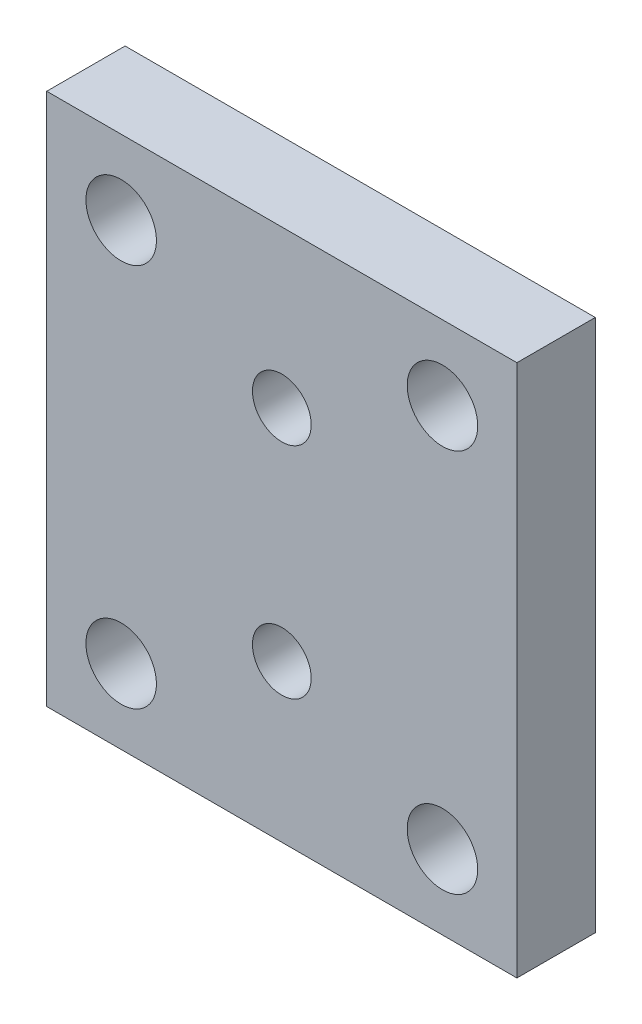
ISO-10303-21;
HEADER;
FILE_DESCRIPTION(('STEP AP214'),'2;1');
FILE_NAME('part.step','',(''),(''),'','','');
FILE_SCHEMA(('AUTOMOTIVE_DESIGN { 1 0 10303 214 1 1 1 1 }'));
ENDSEC;
DATA;
#1=APPLICATION_CONTEXT('core data for automotive mechanical design processes');
#2=APPLICATION_PROTOCOL_DEFINITION('international standard','automotive_design',2000,#1);
#3=PRODUCT_CONTEXT('',#1,'mechanical');
#4=PRODUCT('Part','Part','',(#3));
#5=PRODUCT_RELATED_PRODUCT_CATEGORY('part','',(#4));
#6=PRODUCT_DEFINITION_FORMATION('','',#4);
#7=PRODUCT_DEFINITION_CONTEXT('part definition',#1,'design');
#8=PRODUCT_DEFINITION('design','',#6,#7);
#9=PRODUCT_DEFINITION_SHAPE('','',#8);
#10=(LENGTH_UNIT() NAMED_UNIT(*) SI_UNIT(.MILLI.,.METRE.));
#11=(NAMED_UNIT(*) PLANE_ANGLE_UNIT() SI_UNIT($,.RADIAN.));
#12=(NAMED_UNIT(*) SI_UNIT($,.STERADIAN.) SOLID_ANGLE_UNIT());
#13=UNCERTAINTY_MEASURE_WITH_UNIT(LENGTH_MEASURE(1.E-05),#10,'distance_accuracy_value','');
#14=(GEOMETRIC_REPRESENTATION_CONTEXT(3) GLOBAL_UNCERTAINTY_ASSIGNED_CONTEXT((#13)) GLOBAL_UNIT_ASSIGNED_CONTEXT((#10,
#11,#12)) REPRESENTATION_CONTEXT('',''));
#15=CARTESIAN_POINT('',(0.,0.,0.));
#16=DIRECTION('',(0.,0.,1.));
#17=DIRECTION('',(1.,0.,0.));
#18=AXIS2_PLACEMENT_3D('',#15,#16,#17);
#19=CARTESIAN_POINT('',(0.,0.,5.));
#20=DIRECTION('',(0.,0.,-1.));
#21=DIRECTION('',(-1.,0.,0.));
#22=AXIS2_PLACEMENT_3D('',#19,#20,#21);
#23=PLANE('',#22);
#24=DIRECTION('',(0.,-1.,0.));
#25=VECTOR('',#24,1.);
#26=CARTESIAN_POINT('',(0.,0.,5.));
#27=LINE('',#26,#25);
#28=CARTESIAN_POINT('',(0.,34.,5.));
#29=VERTEX_POINT('',#28);
#30=CARTESIAN_POINT('',(0.,0.,5.));
#31=VERTEX_POINT('',#30);
#32=EDGE_CURVE('E89',#29,#31,#27,.T.);
#33=ORIENTED_EDGE('',*,*,#32,.T.);
#34=DIRECTION('',(1.,0.,0.));
#35=VECTOR('',#34,1.);
#36=CARTESIAN_POINT('',(0.,0.,5.));
#37=LINE('',#36,#35);
#38=CARTESIAN_POINT('',(30.,0.,5.));
#39=VERTEX_POINT('',#38);
#40=EDGE_CURVE('E84',#31,#39,#37,.T.);
#41=ORIENTED_EDGE('',*,*,#40,.T.);
#42=DIRECTION('',(0.,1.,0.));
#43=VECTOR('',#42,1.);
#44=CARTESIAN_POINT('',(30.,0.,5.));
#45=LINE('',#44,#43);
#46=CARTESIAN_POINT('',(30.,34.,5.));
#47=VERTEX_POINT('',#46);
#48=EDGE_CURVE('E87',#39,#47,#45,.T.);
#49=ORIENTED_EDGE('',*,*,#48,.T.);
#50=DIRECTION('',(-1.,0.,0.));
#51=VECTOR('',#50,1.);
#52=CARTESIAN_POINT('',(0.,34.,5.));
#53=LINE('',#52,#51);
#54=EDGE_CURVE('E54',#47,#29,#53,.T.);
#55=ORIENTED_EDGE('',*,*,#54,.T.);
#56=EDGE_LOOP('',(#33,#41,#49,#55));
#57=FACE_BOUND('',#56,.T.);
#58=CARTESIAN_POINT('',(4.75,29.25,5.));
#59=DIRECTION('',(0.,0.,1.));
#60=DIRECTION('',(1.,0.,0.));
#61=AXIS2_PLACEMENT_3D('',#58,#59,#60);
#62=CIRCLE('',#61,2.25);
#63=CARTESIAN_POINT('',(7.,29.25,5.));
#64=VERTEX_POINT('',#63);
#65=EDGE_CURVE('E104',#64,#64,#62,.T.);
#66=ORIENTED_EDGE('',*,*,#65,.F.);
#67=EDGE_LOOP('',(#66));
#68=FACE_BOUND('',#67,.T.);
#69=CARTESIAN_POINT('',(25.25,29.25,5.));
#70=DIRECTION('',(0.,0.,1.));
#71=DIRECTION('',(1.,0.,0.));
#72=AXIS2_PLACEMENT_3D('',#69,#70,#71);
#73=CIRCLE('',#72,2.25000000000001);
#74=CARTESIAN_POINT('',(27.5,29.25,5.));
#75=VERTEX_POINT('',#74);
#76=EDGE_CURVE('E119',#75,#75,#73,.T.);
#77=ORIENTED_EDGE('',*,*,#76,.F.);
#78=EDGE_LOOP('',(#77));
#79=FACE_BOUND('',#78,.T.);
#80=CARTESIAN_POINT('',(25.25,4.75,5.));
#81=DIRECTION('',(0.,0.,1.));
#82=DIRECTION('',(1.,0.,0.));
#83=AXIS2_PLACEMENT_3D('',#80,#81,#82);
#84=CIRCLE('',#83,2.25);
#85=CARTESIAN_POINT('',(27.5,4.75,5.));
#86=VERTEX_POINT('',#85);
#87=EDGE_CURVE('E125',#86,#86,#84,.T.);
#88=ORIENTED_EDGE('',*,*,#87,.F.);
#89=EDGE_LOOP('',(#88));
#90=FACE_BOUND('',#89,.T.);
#91=CARTESIAN_POINT('',(4.75,4.75,5.));
#92=DIRECTION('',(0.,0.,1.));
#93=DIRECTION('',(1.,0.,0.));
#94=AXIS2_PLACEMENT_3D('',#91,#92,#93);
#95=CIRCLE('',#94,2.25);
#96=CARTESIAN_POINT('',(7.,4.75,5.));
#97=VERTEX_POINT('',#96);
#98=EDGE_CURVE('E131',#97,#97,#95,.T.);
#99=ORIENTED_EDGE('',*,*,#98,.F.);
#100=EDGE_LOOP('',(#99));
#101=FACE_BOUND('',#100,.T.);
#102=CARTESIAN_POINT('',(15.,24.,5.));
#103=DIRECTION('',(0.,0.,1.));
#104=DIRECTION('',(1.,0.,0.));
#105=AXIS2_PLACEMENT_3D('',#102,#103,#104);
#106=CIRCLE('',#105,1.875);
#107=CARTESIAN_POINT('',(16.875,24.,5.));
#108=VERTEX_POINT('',#107);
#109=EDGE_CURVE('E137',#108,#108,#106,.T.);
#110=ORIENTED_EDGE('',*,*,#109,.F.);
#111=EDGE_LOOP('',(#110));
#112=FACE_BOUND('',#111,.T.);
#113=CARTESIAN_POINT('',(15.,10.,5.));
#114=DIRECTION('',(0.,0.,1.));
#115=DIRECTION('',(1.,0.,0.));
#116=AXIS2_PLACEMENT_3D('',#113,#114,#115);
#117=CIRCLE('',#116,1.87500000000001);
#118=CARTESIAN_POINT('',(16.875,10.,5.));
#119=VERTEX_POINT('',#118);
#120=EDGE_CURVE('E143',#119,#119,#117,.T.);
#121=ORIENTED_EDGE('',*,*,#120,.F.);
#122=EDGE_LOOP('',(#121));
#123=FACE_BOUND('',#122,.T.);
#124=ADVANCED_FACE('F37',(#57,#68,#79,#90,#101,#112,#123),#23,.F.);
#125=CARTESIAN_POINT('',(0.,0.,0.));
#126=DIRECTION('',(0.,0.,-1.));
#127=DIRECTION('',(-1.,0.,0.));
#128=AXIS2_PLACEMENT_3D('',#125,#126,#127);
#129=PLANE('',#128);
#130=CARTESIAN_POINT('',(15.,24.,0.));
#131=DIRECTION('',(0.,0.,1.));
#132=DIRECTION('',(1.,0.,0.));
#133=AXIS2_PLACEMENT_3D('',#130,#131,#132);
#134=CIRCLE('',#133,1.875);
#135=CARTESIAN_POINT('',(16.875,24.,0.));
#136=VERTEX_POINT('',#135);
#137=EDGE_CURVE('E140',#136,#136,#134,.T.);
#138=ORIENTED_EDGE('',*,*,#137,.T.);
#139=EDGE_LOOP('',(#138));
#140=FACE_BOUND('',#139,.T.);
#141=CARTESIAN_POINT('',(25.25,4.75,0.));
#142=DIRECTION('',(0.,0.,1.));
#143=DIRECTION('',(1.,0.,0.));
#144=AXIS2_PLACEMENT_3D('',#141,#142,#143);
#145=CIRCLE('',#144,2.25);
#146=CARTESIAN_POINT('',(27.5,4.75,0.));
#147=VERTEX_POINT('',#146);
#148=EDGE_CURVE('E128',#147,#147,#145,.T.);
#149=ORIENTED_EDGE('',*,*,#148,.T.);
#150=EDGE_LOOP('',(#149));
#151=FACE_BOUND('',#150,.T.);
#152=CARTESIAN_POINT('',(4.75,29.25,0.));
#153=DIRECTION('',(0.,0.,1.));
#154=DIRECTION('',(1.,0.,0.));
#155=AXIS2_PLACEMENT_3D('',#152,#153,#154);
#156=CIRCLE('',#155,2.25);
#157=CARTESIAN_POINT('',(7.,29.25,0.));
#158=VERTEX_POINT('',#157);
#159=EDGE_CURVE('E116',#158,#158,#156,.T.);
#160=ORIENTED_EDGE('',*,*,#159,.T.);
#161=EDGE_LOOP('',(#160));
#162=FACE_BOUND('',#161,.T.);
#163=DIRECTION('',(0.,-1.,0.));
#164=VECTOR('',#163,1.);
#165=CARTESIAN_POINT('',(0.,0.,0.));
#166=LINE('',#165,#164);
#167=CARTESIAN_POINT('',(0.,34.,0.));
#168=VERTEX_POINT('',#167);
#169=CARTESIAN_POINT('',(0.,0.,0.));
#170=VERTEX_POINT('',#169);
#171=EDGE_CURVE('E101',#168,#170,#166,.T.);
#172=ORIENTED_EDGE('',*,*,#171,.F.);
#173=DIRECTION('',(-1.,0.,0.));
#174=VECTOR('',#173,1.);
#175=CARTESIAN_POINT('',(0.,34.,0.));
#176=LINE('',#175,#174);
#177=CARTESIAN_POINT('',(30.,34.,0.));
#178=VERTEX_POINT('',#177);
#179=EDGE_CURVE('E77',#178,#168,#176,.T.);
#180=ORIENTED_EDGE('',*,*,#179,.F.);
#181=DIRECTION('',(0.,1.,0.));
#182=VECTOR('',#181,1.);
#183=CARTESIAN_POINT('',(30.,0.,0.));
#184=LINE('',#183,#182);
#185=CARTESIAN_POINT('',(30.,0.,0.));
#186=VERTEX_POINT('',#185);
#187=EDGE_CURVE('E71',#186,#178,#184,.T.);
#188=ORIENTED_EDGE('',*,*,#187,.F.);
#189=DIRECTION('',(1.,0.,0.));
#190=VECTOR('',#189,1.);
#191=CARTESIAN_POINT('',(0.,0.,0.));
#192=LINE('',#191,#190);
#193=EDGE_CURVE('E93',#170,#186,#192,.T.);
#194=ORIENTED_EDGE('',*,*,#193,.F.);
#195=EDGE_LOOP('',(#172,#180,#188,#194));
#196=FACE_BOUND('',#195,.T.);
#197=CARTESIAN_POINT('',(25.25,29.25,0.));
#198=DIRECTION('',(0.,0.,1.));
#199=DIRECTION('',(1.,0.,0.));
#200=AXIS2_PLACEMENT_3D('',#197,#198,#199);
#201=CIRCLE('',#200,2.25000000000001);
#202=CARTESIAN_POINT('',(27.5,29.25,0.));
#203=VERTEX_POINT('',#202);
#204=EDGE_CURVE('E122',#203,#203,#201,.T.);
#205=ORIENTED_EDGE('',*,*,#204,.T.);
#206=EDGE_LOOP('',(#205));
#207=FACE_BOUND('',#206,.T.);
#208=CARTESIAN_POINT('',(4.75,4.75,0.));
#209=DIRECTION('',(0.,0.,1.));
#210=DIRECTION('',(1.,0.,0.));
#211=AXIS2_PLACEMENT_3D('',#208,#209,#210);
#212=CIRCLE('',#211,2.25);
#213=CARTESIAN_POINT('',(7.,4.75,0.));
#214=VERTEX_POINT('',#213);
#215=EDGE_CURVE('E134',#214,#214,#212,.T.);
#216=ORIENTED_EDGE('',*,*,#215,.T.);
#217=EDGE_LOOP('',(#216));
#218=FACE_BOUND('',#217,.T.);
#219=CARTESIAN_POINT('',(15.,10.,0.));
#220=DIRECTION('',(0.,0.,1.));
#221=DIRECTION('',(1.,0.,0.));
#222=AXIS2_PLACEMENT_3D('',#219,#220,#221);
#223=CIRCLE('',#222,1.87500000000001);
#224=CARTESIAN_POINT('',(16.875,10.,0.));
#225=VERTEX_POINT('',#224);
#226=EDGE_CURVE('E146',#225,#225,#223,.T.);
#227=ORIENTED_EDGE('',*,*,#226,.T.);
#228=EDGE_LOOP('',(#227));
#229=FACE_BOUND('',#228,.T.);
#230=ADVANCED_FACE('F112',(#140,#151,#162,#196,#207,#218,#229),#129,.T.);
#231=CARTESIAN_POINT('',(0.,0.,5.));
#232=DIRECTION('',(1.,0.,0.));
#233=DIRECTION('',(0.,1.,0.));
#234=AXIS2_PLACEMENT_3D('',#231,#232,#233);
#235=PLANE('',#234);
#236=ORIENTED_EDGE('',*,*,#171,.T.);
#237=DIRECTION('',(0.,0.,-1.));
#238=VECTOR('',#237,1.);
#239=CARTESIAN_POINT('',(0.,0.,5.));
#240=LINE('',#239,#238);
#241=EDGE_CURVE('E11',#31,#170,#240,.T.);
#242=ORIENTED_EDGE('',*,*,#241,.F.);
#243=ORIENTED_EDGE('',*,*,#32,.F.);
#244=DIRECTION('',(0.,0.,-1.));
#245=VECTOR('',#244,1.);
#246=CARTESIAN_POINT('',(0.,34.,5.));
#247=LINE('',#246,#245);
#248=EDGE_CURVE('E97',#29,#168,#247,.T.);
#249=ORIENTED_EDGE('',*,*,#248,.T.);
#250=EDGE_LOOP('',(#236,#242,#243,#249));
#251=FACE_BOUND('',#250,.T.);
#252=ADVANCED_FACE('F39',(#251),#235,.F.);
#253=CARTESIAN_POINT('',(0.,0.,5.));
#254=DIRECTION('',(0.,1.,0.));
#255=DIRECTION('',(0.,0.,1.));
#256=AXIS2_PLACEMENT_3D('',#253,#254,#255);
#257=PLANE('',#256);
#258=ORIENTED_EDGE('',*,*,#193,.T.);
#259=DIRECTION('',(0.,0.,-1.));
#260=VECTOR('',#259,1.);
#261=CARTESIAN_POINT('',(30.,0.,5.));
#262=LINE('',#261,#260);
#263=EDGE_CURVE('E46',#39,#186,#262,.T.);
#264=ORIENTED_EDGE('',*,*,#263,.F.);
#265=ORIENTED_EDGE('',*,*,#40,.F.);
#266=ORIENTED_EDGE('',*,*,#241,.T.);
#267=EDGE_LOOP('',(#258,#264,#265,#266));
#268=FACE_BOUND('',#267,.T.);
#269=ADVANCED_FACE('F92',(#268),#257,.F.);
#270=CARTESIAN_POINT('',(30.,0.,5.));
#271=DIRECTION('',(-1.,0.,0.));
#272=DIRECTION('',(0.,-1.,0.));
#273=AXIS2_PLACEMENT_3D('',#270,#271,#272);
#274=PLANE('',#273);
#275=ORIENTED_EDGE('',*,*,#187,.T.);
#276=DIRECTION('',(0.,0.,-1.));
#277=VECTOR('',#276,1.);
#278=CARTESIAN_POINT('',(30.,34.,5.));
#279=LINE('',#278,#277);
#280=EDGE_CURVE('E94',#47,#178,#279,.T.);
#281=ORIENTED_EDGE('',*,*,#280,.F.);
#282=ORIENTED_EDGE('',*,*,#48,.F.);
#283=ORIENTED_EDGE('',*,*,#263,.T.);
#284=EDGE_LOOP('',(#275,#281,#282,#283));
#285=FACE_BOUND('',#284,.T.);
#286=ADVANCED_FACE('F95',(#285),#274,.F.);
#287=CARTESIAN_POINT('',(0.,34.,5.));
#288=DIRECTION('',(0.,-1.,0.));
#289=DIRECTION('',(0.,0.,-1.));
#290=AXIS2_PLACEMENT_3D('',#287,#288,#289);
#291=PLANE('',#290);
#292=ORIENTED_EDGE('',*,*,#179,.T.);
#293=ORIENTED_EDGE('',*,*,#248,.F.);
#294=ORIENTED_EDGE('',*,*,#54,.F.);
#295=ORIENTED_EDGE('',*,*,#280,.T.);
#296=EDGE_LOOP('',(#292,#293,#294,#295));
#297=FACE_BOUND('',#296,.T.);
#298=ADVANCED_FACE('F109',(#297),#291,.F.);
#299=CARTESIAN_POINT('',(4.75,29.25,5.));
#300=DIRECTION('',(0.,0.,-1.));
#301=DIRECTION('',(-1.,0.,0.));
#302=AXIS2_PLACEMENT_3D('',#299,#300,#301);
#303=CYLINDRICAL_SURFACE('',#302,2.25);
#304=ORIENTED_EDGE('',*,*,#65,.T.);
#305=EDGE_LOOP('',(#304));
#306=FACE_BOUND('',#305,.T.);
#307=ORIENTED_EDGE('',*,*,#159,.F.);
#308=EDGE_LOOP('',(#307));
#309=FACE_BOUND('',#308,.T.);
#310=ADVANCED_FACE('F163',(#306,#309),#303,.F.);
#311=CARTESIAN_POINT('',(25.25,29.25,5.));
#312=DIRECTION('',(0.,0.,-1.));
#313=DIRECTION('',(-1.,0.,0.));
#314=AXIS2_PLACEMENT_3D('',#311,#312,#313);
#315=CYLINDRICAL_SURFACE('',#314,2.25000000000001);
#316=ORIENTED_EDGE('',*,*,#76,.T.);
#317=EDGE_LOOP('',(#316));
#318=FACE_BOUND('',#317,.T.);
#319=ORIENTED_EDGE('',*,*,#204,.F.);
#320=EDGE_LOOP('',(#319));
#321=FACE_BOUND('',#320,.T.);
#322=ADVANCED_FACE('F217',(#318,#321),#315,.F.);
#323=CARTESIAN_POINT('',(25.25,4.75,5.));
#324=DIRECTION('',(0.,0.,-1.));
#325=DIRECTION('',(-1.,0.,0.));
#326=AXIS2_PLACEMENT_3D('',#323,#324,#325);
#327=CYLINDRICAL_SURFACE('',#326,2.25);
#328=ORIENTED_EDGE('',*,*,#87,.T.);
#329=EDGE_LOOP('',(#328));
#330=FACE_BOUND('',#329,.T.);
#331=ORIENTED_EDGE('',*,*,#148,.F.);
#332=EDGE_LOOP('',(#331));
#333=FACE_BOUND('',#332,.T.);
#334=ADVANCED_FACE('F226',(#330,#333),#327,.F.);
#335=CARTESIAN_POINT('',(4.75,4.75,5.));
#336=DIRECTION('',(0.,0.,-1.));
#337=DIRECTION('',(-1.,0.,0.));
#338=AXIS2_PLACEMENT_3D('',#335,#336,#337);
#339=CYLINDRICAL_SURFACE('',#338,2.25);
#340=ORIENTED_EDGE('',*,*,#98,.T.);
#341=EDGE_LOOP('',(#340));
#342=FACE_BOUND('',#341,.T.);
#343=ORIENTED_EDGE('',*,*,#215,.F.);
#344=EDGE_LOOP('',(#343));
#345=FACE_BOUND('',#344,.T.);
#346=ADVANCED_FACE('F235',(#342,#345),#339,.F.);
#347=CARTESIAN_POINT('',(15.,24.,5.));
#348=DIRECTION('',(0.,0.,-1.));
#349=DIRECTION('',(-1.,0.,0.));
#350=AXIS2_PLACEMENT_3D('',#347,#348,#349);
#351=CYLINDRICAL_SURFACE('',#350,1.875);
#352=ORIENTED_EDGE('',*,*,#109,.T.);
#353=EDGE_LOOP('',(#352));
#354=FACE_BOUND('',#353,.T.);
#355=ORIENTED_EDGE('',*,*,#137,.F.);
#356=EDGE_LOOP('',(#355));
#357=FACE_BOUND('',#356,.T.);
#358=ADVANCED_FACE('F245',(#354,#357),#351,.F.);
#359=CARTESIAN_POINT('',(15.,10.,5.));
#360=DIRECTION('',(0.,0.,-1.));
#361=DIRECTION('',(-1.,0.,0.));
#362=AXIS2_PLACEMENT_3D('',#359,#360,#361);
#363=CYLINDRICAL_SURFACE('',#362,1.87500000000001);
#364=ORIENTED_EDGE('',*,*,#120,.T.);
#365=EDGE_LOOP('',(#364));
#366=FACE_BOUND('',#365,.T.);
#367=ORIENTED_EDGE('',*,*,#226,.F.);
#368=EDGE_LOOP('',(#367));
#369=FACE_BOUND('',#368,.T.);
#370=ADVANCED_FACE('F152',(#366,#369),#363,.F.);
#371=CLOSED_SHELL('',(#124,#230,#252,#269,#286,#298,#310,#322,#334,#346,#358,#370));
#372=MANIFOLD_SOLID_BREP('B2',#371);
#373=ADVANCED_BREP_SHAPE_REPRESENTATION('',(#18,#372),#14);
#374=SHAPE_DEFINITION_REPRESENTATION(#9,#373);
ENDSEC;
END-ISO-10303-21;
